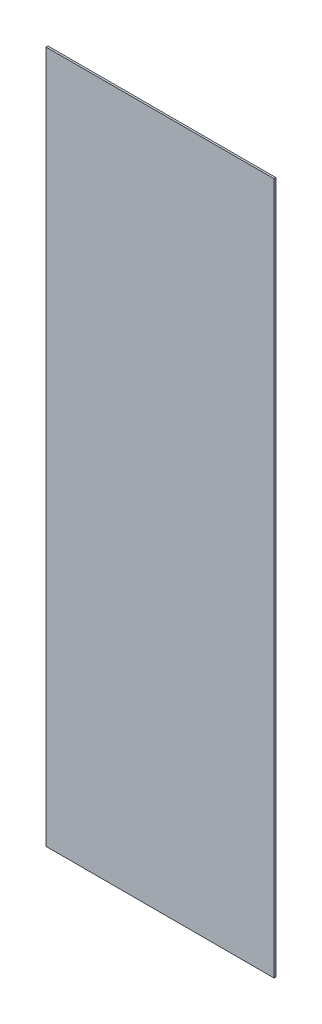
ISO-10303-21;
HEADER;
FILE_DESCRIPTION(('STEP AP214'),'2;1');
FILE_NAME('part.step','',(''),(''),'','','');
FILE_SCHEMA(('AUTOMOTIVE_DESIGN { 1 0 10303 214 1 1 1 1 }'));
ENDSEC;
DATA;
#1=APPLICATION_CONTEXT('core data for automotive mechanical design processes');
#2=APPLICATION_PROTOCOL_DEFINITION('international standard','automotive_design',2000,#1);
#3=PRODUCT_CONTEXT('',#1,'mechanical');
#4=PRODUCT('Part','Part','',(#3));
#5=PRODUCT_RELATED_PRODUCT_CATEGORY('part','',(#4));
#6=PRODUCT_DEFINITION_FORMATION('','',#4);
#7=PRODUCT_DEFINITION_CONTEXT('part definition',#1,'design');
#8=PRODUCT_DEFINITION('design','',#6,#7);
#9=PRODUCT_DEFINITION_SHAPE('','',#8);
#10=(LENGTH_UNIT() NAMED_UNIT(*) SI_UNIT(.MILLI.,.METRE.));
#11=(NAMED_UNIT(*) PLANE_ANGLE_UNIT() SI_UNIT($,.RADIAN.));
#12=(NAMED_UNIT(*) SI_UNIT($,.STERADIAN.) SOLID_ANGLE_UNIT());
#13=UNCERTAINTY_MEASURE_WITH_UNIT(LENGTH_MEASURE(1.E-05),#10,'distance_accuracy_value','');
#14=(GEOMETRIC_REPRESENTATION_CONTEXT(3) GLOBAL_UNCERTAINTY_ASSIGNED_CONTEXT((#13)) GLOBAL_UNIT_ASSIGNED_CONTEXT((#10,
#11,#12)) REPRESENTATION_CONTEXT('',''));
#15=CARTESIAN_POINT('',(0.,0.,0.));
#16=DIRECTION('',(0.,0.,1.));
#17=DIRECTION('',(1.,0.,0.));
#18=AXIS2_PLACEMENT_3D('',#15,#16,#17);
#19=CARTESIAN_POINT('',(156.500000205687,-10.0000000002017,-1.));
#20=DIRECTION('',(-1.,0.,0.));
#21=DIRECTION('',(0.,0.,1.));
#22=AXIS2_PLACEMENT_3D('',#19,#20,#21);
#23=PLANE('',#22);
#24=DIRECTION('',(0.,-1.,0.));
#25=VECTOR('',#24,1.);
#26=CARTESIAN_POINT('',(156.500000205687,-10.0000000002017,0.));
#27=LINE('',#26,#25);
#28=CARTESIAN_POINT('',(156.500000205687,-10.0000000002017,0.));
#29=VERTEX_POINT('',#28);
#30=CARTESIAN_POINT('',(156.500000205687,-369.999999959234,0.));
#31=VERTEX_POINT('',#30);
#32=EDGE_CURVE('E102',#29,#31,#27,.T.);
#33=ORIENTED_EDGE('',*,*,#32,.F.);
#34=DIRECTION('',(0.,0.,1.));
#35=VECTOR('',#34,1.);
#36=CARTESIAN_POINT('',(156.500000205687,-10.0000000002017,-1.));
#37=LINE('',#36,#35);
#38=CARTESIAN_POINT('',(156.500000205687,-10.0000000002017,-1.));
#39=VERTEX_POINT('',#38);
#40=EDGE_CURVE('E11',#39,#29,#37,.T.);
#41=ORIENTED_EDGE('',*,*,#40,.F.);
#42=DIRECTION('',(0.,-1.,0.));
#43=VECTOR('',#42,1.);
#44=CARTESIAN_POINT('',(156.500000205687,-10.0000000002017,-1.));
#45=LINE('',#44,#43);
#46=CARTESIAN_POINT('',(156.500000205687,-369.999999959234,-1.));
#47=VERTEX_POINT('',#46);
#48=EDGE_CURVE('E96',#39,#47,#45,.T.);
#49=ORIENTED_EDGE('',*,*,#48,.T.);
#50=DIRECTION('',(0.,0.,1.));
#51=VECTOR('',#50,1.);
#52=CARTESIAN_POINT('',(156.500000205687,-369.999999959234,-1.));
#53=LINE('',#52,#51);
#54=EDGE_CURVE('E41',#47,#31,#53,.T.);
#55=ORIENTED_EDGE('',*,*,#54,.T.);
#56=EDGE_LOOP('',(#33,#41,#49,#55));
#57=FACE_BOUND('',#56,.T.);
#58=ADVANCED_FACE('F38',(#57),#23,.T.);
#59=CARTESIAN_POINT('',(156.500000205687,-10.0000000002017,-1.));
#60=DIRECTION('',(0.,1.,0.));
#61=DIRECTION('',(0.,0.,1.));
#62=AXIS2_PLACEMENT_3D('',#59,#60,#61);
#63=PLANE('',#62);
#64=DIRECTION('',(-1.,0.,0.));
#65=VECTOR('',#64,1.);
#66=CARTESIAN_POINT('',(156.500000205687,-10.0000000002017,0.));
#67=LINE('',#66,#65);
#68=CARTESIAN_POINT('',(274.999999999999,-10.0000000002017,0.));
#69=VERTEX_POINT('',#68);
#70=EDGE_CURVE('E98',#69,#29,#67,.T.);
#71=ORIENTED_EDGE('',*,*,#70,.F.);
#72=DIRECTION('',(0.,0.,1.));
#73=VECTOR('',#72,1.);
#74=CARTESIAN_POINT('',(274.999999999999,-10.0000000002017,-1.));
#75=LINE('',#74,#73);
#76=CARTESIAN_POINT('',(274.999999999999,-10.0000000002017,-1.));
#77=VERTEX_POINT('',#76);
#78=EDGE_CURVE('E47',#77,#69,#75,.T.);
#79=ORIENTED_EDGE('',*,*,#78,.F.);
#80=DIRECTION('',(-1.,0.,0.));
#81=VECTOR('',#80,1.);
#82=CARTESIAN_POINT('',(156.500000205687,-10.0000000002017,-1.));
#83=LINE('',#82,#81);
#84=EDGE_CURVE('E93',#77,#39,#83,.T.);
#85=ORIENTED_EDGE('',*,*,#84,.T.);
#86=ORIENTED_EDGE('',*,*,#40,.T.);
#87=EDGE_LOOP('',(#71,#79,#85,#86));
#88=FACE_BOUND('',#87,.T.);
#89=ADVANCED_FACE('F112',(#88),#63,.T.);
#90=CARTESIAN_POINT('',(274.999999999999,-10.0000000002017,-1.));
#91=DIRECTION('',(1.,0.,0.));
#92=DIRECTION('',(0.,0.,-1.));
#93=AXIS2_PLACEMENT_3D('',#90,#91,#92);
#94=PLANE('',#93);
#95=DIRECTION('',(0.,1.,0.));
#96=VECTOR('',#95,1.);
#97=CARTESIAN_POINT('',(274.999999999999,-10.0000000002017,0.));
#98=LINE('',#97,#96);
#99=CARTESIAN_POINT('',(274.999999999999,-369.999999959234,0.));
#100=VERTEX_POINT('',#99);
#101=EDGE_CURVE('E88',#100,#69,#98,.T.);
#102=ORIENTED_EDGE('',*,*,#101,.F.);
#103=DIRECTION('',(0.,0.,1.));
#104=VECTOR('',#103,1.);
#105=CARTESIAN_POINT('',(274.999999999999,-369.999999959234,-1.));
#106=LINE('',#105,#104);
#107=CARTESIAN_POINT('',(274.999999999999,-369.999999959234,-1.));
#108=VERTEX_POINT('',#107);
#109=EDGE_CURVE('E83',#108,#100,#106,.T.);
#110=ORIENTED_EDGE('',*,*,#109,.F.);
#111=DIRECTION('',(0.,1.,0.));
#112=VECTOR('',#111,1.);
#113=CARTESIAN_POINT('',(274.999999999999,-10.0000000002017,-1.));
#114=LINE('',#113,#112);
#115=EDGE_CURVE('E86',#108,#77,#114,.T.);
#116=ORIENTED_EDGE('',*,*,#115,.T.);
#117=ORIENTED_EDGE('',*,*,#78,.T.);
#118=EDGE_LOOP('',(#102,#110,#116,#117));
#119=FACE_BOUND('',#118,.T.);
#120=ADVANCED_FACE('F85',(#119),#94,.T.);
#121=CARTESIAN_POINT('',(156.500000205687,-369.999999959234,-1.));
#122=DIRECTION('',(0.,-1.,0.));
#123=DIRECTION('',(0.,0.,-1.));
#124=AXIS2_PLACEMENT_3D('',#121,#122,#123);
#125=PLANE('',#124);
#126=DIRECTION('',(1.,0.,0.));
#127=VECTOR('',#126,1.);
#128=CARTESIAN_POINT('',(156.500000205687,-369.999999959234,0.));
#129=LINE('',#128,#127);
#130=EDGE_CURVE('E105',#31,#100,#129,.T.);
#131=ORIENTED_EDGE('',*,*,#130,.F.);
#132=ORIENTED_EDGE('',*,*,#54,.F.);
#133=DIRECTION('',(1.,0.,0.));
#134=VECTOR('',#133,1.);
#135=CARTESIAN_POINT('',(156.500000205687,-369.999999959234,-1.));
#136=LINE('',#135,#134);
#137=EDGE_CURVE('E92',#47,#108,#136,.T.);
#138=ORIENTED_EDGE('',*,*,#137,.T.);
#139=ORIENTED_EDGE('',*,*,#109,.T.);
#140=EDGE_LOOP('',(#131,#132,#138,#139));
#141=FACE_BOUND('',#140,.T.);
#142=ADVANCED_FACE('F95',(#141),#125,.T.);
#143=CARTESIAN_POINT('',(0.,0.,-1.));
#144=DIRECTION('',(0.,0.,1.));
#145=DIRECTION('',(1.,0.,0.));
#146=AXIS2_PLACEMENT_3D('',#143,#144,#145);
#147=PLANE('',#146);
#148=ORIENTED_EDGE('',*,*,#48,.F.);
#149=ORIENTED_EDGE('',*,*,#84,.F.);
#150=ORIENTED_EDGE('',*,*,#115,.F.);
#151=ORIENTED_EDGE('',*,*,#137,.F.);
#152=EDGE_LOOP('',(#148,#149,#150,#151));
#153=FACE_BOUND('',#152,.T.);
#154=ADVANCED_FACE('F91',(#153),#147,.F.);
#155=CARTESIAN_POINT('',(0.,0.,0.));
#156=DIRECTION('',(0.,0.,1.));
#157=DIRECTION('',(1.,0.,0.));
#158=AXIS2_PLACEMENT_3D('',#155,#156,#157);
#159=PLANE('',#158);
#160=ORIENTED_EDGE('',*,*,#32,.T.);
#161=ORIENTED_EDGE('',*,*,#130,.T.);
#162=ORIENTED_EDGE('',*,*,#101,.T.);
#163=ORIENTED_EDGE('',*,*,#70,.T.);
#164=EDGE_LOOP('',(#160,#161,#162,#163));
#165=FACE_BOUND('',#164,.T.);
#166=ADVANCED_FACE('F111',(#165),#159,.T.);
#167=CLOSED_SHELL('',(#58,#89,#120,#142,#154,#166));
#168=MANIFOLD_SOLID_BREP('B2',#167);
#169=ADVANCED_BREP_SHAPE_REPRESENTATION('',(#18,#168),#14);
#170=SHAPE_DEFINITION_REPRESENTATION(#9,#169);
ENDSEC;
END-ISO-10303-21;
